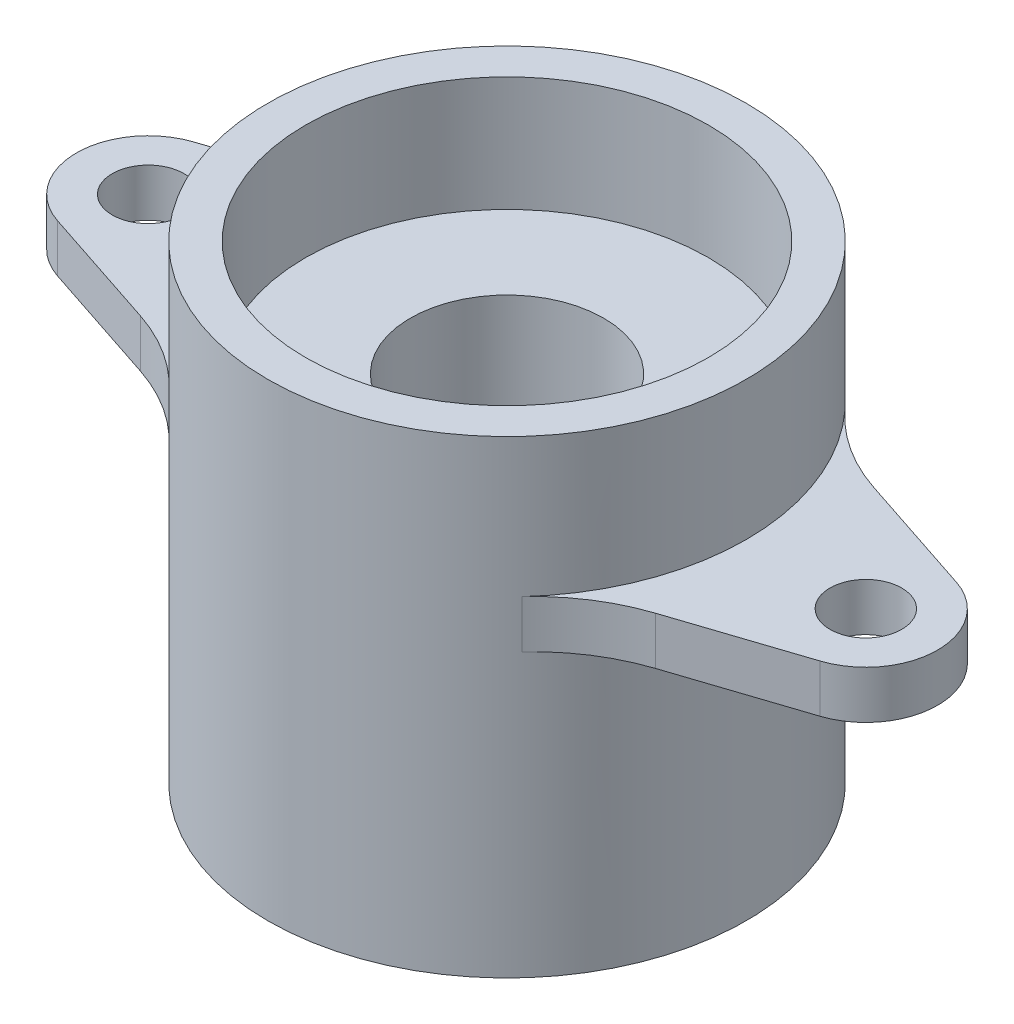
ISO-10303-21;
HEADER;
FILE_DESCRIPTION(('STEP AP214'),'2;1');
FILE_NAME('part.step','',(''),(''),'','','');
FILE_SCHEMA(('AUTOMOTIVE_DESIGN { 1 0 10303 214 1 1 1 1 }'));
ENDSEC;
DATA;
#1=APPLICATION_CONTEXT('core data for automotive mechanical design processes');
#2=APPLICATION_PROTOCOL_DEFINITION('international standard','automotive_design',2000,#1);
#3=PRODUCT_CONTEXT('',#1,'mechanical');
#4=PRODUCT('Part','Part','',(#3));
#5=PRODUCT_RELATED_PRODUCT_CATEGORY('part','',(#4));
#6=PRODUCT_DEFINITION_FORMATION('','',#4);
#7=PRODUCT_DEFINITION_CONTEXT('part definition',#1,'design');
#8=PRODUCT_DEFINITION('design','',#6,#7);
#9=PRODUCT_DEFINITION_SHAPE('','',#8);
#10=(LENGTH_UNIT() NAMED_UNIT(*) SI_UNIT(.MILLI.,.METRE.));
#11=(NAMED_UNIT(*) PLANE_ANGLE_UNIT() SI_UNIT($,.RADIAN.));
#12=(NAMED_UNIT(*) SI_UNIT($,.STERADIAN.) SOLID_ANGLE_UNIT());
#13=UNCERTAINTY_MEASURE_WITH_UNIT(LENGTH_MEASURE(1.E-05),#10,'distance_accuracy_value','');
#14=(GEOMETRIC_REPRESENTATION_CONTEXT(3) GLOBAL_UNCERTAINTY_ASSIGNED_CONTEXT((#13)) GLOBAL_UNIT_ASSIGNED_CONTEXT((#10,
#11,#12)) REPRESENTATION_CONTEXT('',''));
#15=CARTESIAN_POINT('',(0.,0.,0.));
#16=DIRECTION('',(0.,0.,1.));
#17=DIRECTION('',(1.,0.,0.));
#18=AXIS2_PLACEMENT_3D('',#15,#16,#17);
#19=CARTESIAN_POINT('',(0.,0.,0.));
#20=DIRECTION('',(0.,-1.,0.));
#21=DIRECTION('',(0.,0.,-1.));
#22=AXIS2_PLACEMENT_3D('',#19,#20,#21);
#23=CYLINDRICAL_SURFACE('',#22,25.);
#24=CARTESIAN_POINT('',(0.,24.5,0.));
#25=DIRECTION('',(0.,-1.,0.));
#26=DIRECTION('',(0.,0.,-1.));
#27=AXIS2_PLACEMENT_3D('',#24,#25,#26);
#28=CIRCLE('',#27,25.);
#29=CARTESIAN_POINT('',(0.,24.5,-25.));
#30=VERTEX_POINT('',#29);
#31=EDGE_CURVE('E280',#30,#30,#28,.T.);
#32=ORIENTED_EDGE('',*,*,#31,.T.);
#33=EDGE_LOOP('',(#32));
#34=FACE_BOUND('',#33,.T.);
#35=CARTESIAN_POINT('',(0.,-24.5,0.));
#36=DIRECTION('',(0.,-1.,0.));
#37=DIRECTION('',(0.,0.,-1.));
#38=AXIS2_PLACEMENT_3D('',#35,#36,#37);
#39=CIRCLE('',#38,25.);
#40=CARTESIAN_POINT('',(0.,-24.5,-25.));
#41=VERTEX_POINT('',#40);
#42=EDGE_CURVE('E276',#41,#41,#39,.T.);
#43=ORIENTED_EDGE('',*,*,#42,.F.);
#44=EDGE_LOOP('',(#43));
#45=FACE_BOUND('',#44,.T.);
#46=CARTESIAN_POINT('',(0.,10.,0.));
#47=DIRECTION('',(0.,1.,0.));
#48=DIRECTION('',(0.,0.,1.));
#49=AXIS2_PLACEMENT_3D('',#46,#47,#48);
#50=CIRCLE('',#49,25.);
#51=CARTESIAN_POINT('',(-18.4382654759895,10.,16.8828423624973));
#52=VERTEX_POINT('',#51);
#53=CARTESIAN_POINT('',(-18.4382654759895,10.,-16.8828423624973));
#54=VERTEX_POINT('',#53);
#55=EDGE_CURVE('E291',#52,#54,#50,.F.);
#56=ORIENTED_EDGE('',*,*,#55,.F.);
#57=DIRECTION('',(0.,-1.,0.));
#58=VECTOR('',#57,1.);
#59=CARTESIAN_POINT('',(-18.4382654759895,10.,16.8828423624973));
#60=LINE('',#59,#58);
#61=CARTESIAN_POINT('',(-18.4382654759895,5.,16.8828423624973));
#62=VERTEX_POINT('',#61);
#63=EDGE_CURVE('E245',#52,#62,#60,.T.);
#64=ORIENTED_EDGE('',*,*,#63,.T.);
#65=CARTESIAN_POINT('',(0.,5.,0.));
#66=DIRECTION('',(0.,1.,0.));
#67=DIRECTION('',(0.,0.,1.));
#68=AXIS2_PLACEMENT_3D('',#65,#66,#67);
#69=CIRCLE('',#68,25.);
#70=CARTESIAN_POINT('',(-18.4382654759895,5.,-16.8828423624973));
#71=VERTEX_POINT('',#70);
#72=EDGE_CURVE('E288',#62,#71,#69,.F.);
#73=ORIENTED_EDGE('',*,*,#72,.T.);
#74=DIRECTION('',(0.,-1.,0.));
#75=VECTOR('',#74,1.);
#76=CARTESIAN_POINT('',(-18.4382654759895,10.,-16.8828423624973));
#77=LINE('',#76,#75);
#78=EDGE_CURVE('E241',#54,#71,#77,.T.);
#79=ORIENTED_EDGE('',*,*,#78,.F.);
#80=EDGE_LOOP('',(#56,#64,#73,#79));
#81=FACE_BOUND('',#80,.T.);
#82=CARTESIAN_POINT('',(0.,10.,0.));
#83=DIRECTION('',(0.,-1.,0.));
#84=DIRECTION('',(0.,0.,-1.));
#85=AXIS2_PLACEMENT_3D('',#82,#83,#84);
#86=CIRCLE('',#85,25.);
#87=CARTESIAN_POINT('',(18.4382654759895,10.,16.8828423624973));
#88=VERTEX_POINT('',#87);
#89=CARTESIAN_POINT('',(18.4382654759895,10.,-16.8828423624973));
#90=VERTEX_POINT('',#89);
#91=EDGE_CURVE('E11',#88,#90,#86,.F.);
#92=ORIENTED_EDGE('',*,*,#91,.T.);
#93=DIRECTION('',(0.,-1.,0.));
#94=VECTOR('',#93,1.);
#95=CARTESIAN_POINT('',(18.4382654759895,10.,-16.8828423624973));
#96=LINE('',#95,#94);
#97=CARTESIAN_POINT('',(18.4382654759895,5.,-16.8828423624973));
#98=VERTEX_POINT('',#97);
#99=EDGE_CURVE('E58',#90,#98,#96,.T.);
#100=ORIENTED_EDGE('',*,*,#99,.T.);
#101=CARTESIAN_POINT('',(0.,5.,0.));
#102=DIRECTION('',(0.,-1.,0.));
#103=DIRECTION('',(0.,0.,-1.));
#104=AXIS2_PLACEMENT_3D('',#101,#102,#103);
#105=CIRCLE('',#104,25.);
#106=CARTESIAN_POINT('',(18.4382654759895,5.,16.8828423624973));
#107=VERTEX_POINT('',#106);
#108=EDGE_CURVE('E48',#107,#98,#105,.F.);
#109=ORIENTED_EDGE('',*,*,#108,.F.);
#110=DIRECTION('',(0.,-1.,0.));
#111=VECTOR('',#110,1.);
#112=CARTESIAN_POINT('',(18.4382654759895,10.,16.8828423624973));
#113=LINE('',#112,#111);
#114=EDGE_CURVE('E145',#88,#107,#113,.T.);
#115=ORIENTED_EDGE('',*,*,#114,.F.);
#116=EDGE_LOOP('',(#92,#100,#109,#115));
#117=FACE_BOUND('',#116,.T.);
#118=ADVANCED_FACE('F39',(#34,#45,#81,#117),#23,.T.);
#119=CARTESIAN_POINT('',(0.,0.,0.));
#120=DIRECTION('',(0.,-1.,0.));
#121=DIRECTION('',(0.,0.,-1.));
#122=AXIS2_PLACEMENT_3D('',#119,#120,#121);
#123=CYLINDRICAL_SURFACE('',#122,21.05);
#124=CARTESIAN_POINT('',(0.,12.5,0.));
#125=DIRECTION('',(0.,-1.,0.));
#126=DIRECTION('',(0.,0.,-1.));
#127=AXIS2_PLACEMENT_3D('',#124,#125,#126);
#128=CIRCLE('',#127,21.05);
#129=CARTESIAN_POINT('',(0.,12.5,-21.05));
#130=VERTEX_POINT('',#129);
#131=EDGE_CURVE('E256',#130,#130,#128,.T.);
#132=ORIENTED_EDGE('',*,*,#131,.T.);
#133=EDGE_LOOP('',(#132));
#134=FACE_BOUND('',#133,.T.);
#135=CARTESIAN_POINT('',(0.,24.5,0.));
#136=DIRECTION('',(0.,-1.,0.));
#137=DIRECTION('',(0.,0.,-1.));
#138=AXIS2_PLACEMENT_3D('',#135,#136,#137);
#139=CIRCLE('',#138,21.05);
#140=CARTESIAN_POINT('',(0.,24.5,-21.05));
#141=VERTEX_POINT('',#140);
#142=EDGE_CURVE('E284',#141,#141,#139,.T.);
#143=ORIENTED_EDGE('',*,*,#142,.F.);
#144=EDGE_LOOP('',(#143));
#145=FACE_BOUND('',#144,.T.);
#146=ADVANCED_FACE('F41',(#134,#145),#123,.F.);
#147=CARTESIAN_POINT('',(21.05,24.5,0.));
#148=DIRECTION('',(0.,1.,0.));
#149=DIRECTION('',(0.,0.,1.));
#150=AXIS2_PLACEMENT_3D('',#147,#148,#149);
#151=PLANE('',#150);
#152=ORIENTED_EDGE('',*,*,#142,.T.);
#153=EDGE_LOOP('',(#152));
#154=FACE_BOUND('',#153,.T.);
#155=ORIENTED_EDGE('',*,*,#31,.F.);
#156=EDGE_LOOP('',(#155));
#157=FACE_BOUND('',#156,.T.);
#158=ADVANCED_FACE('F341',(#154,#157),#151,.T.);
#159=CARTESIAN_POINT('',(25.,-24.5,0.));
#160=DIRECTION('',(0.,-1.,0.));
#161=DIRECTION('',(0.,0.,-1.));
#162=AXIS2_PLACEMENT_3D('',#159,#160,#161);
#163=PLANE('',#162);
#164=ORIENTED_EDGE('',*,*,#42,.T.);
#165=EDGE_LOOP('',(#164));
#166=FACE_BOUND('',#165,.T.);
#167=CARTESIAN_POINT('',(0.,-24.5,0.));
#168=DIRECTION('',(0.,-1.,0.));
#169=DIRECTION('',(0.,0.,-1.));
#170=AXIS2_PLACEMENT_3D('',#167,#168,#169);
#171=CIRCLE('',#170,21.05);
#172=CARTESIAN_POINT('',(0.,-24.5,-21.05));
#173=VERTEX_POINT('',#172);
#174=EDGE_CURVE('E272',#173,#173,#171,.T.);
#175=ORIENTED_EDGE('',*,*,#174,.F.);
#176=EDGE_LOOP('',(#175));
#177=FACE_BOUND('',#176,.T.);
#178=ADVANCED_FACE('F345',(#166,#177),#163,.T.);
#179=CARTESIAN_POINT('',(0.,0.,0.));
#180=DIRECTION('',(0.,-1.,0.));
#181=DIRECTION('',(0.,0.,-1.));
#182=AXIS2_PLACEMENT_3D('',#179,#180,#181);
#183=CYLINDRICAL_SURFACE('',#182,21.05);
#184=ORIENTED_EDGE('',*,*,#174,.T.);
#185=EDGE_LOOP('',(#184));
#186=FACE_BOUND('',#185,.T.);
#187=CARTESIAN_POINT('',(0.,-12.5,0.));
#188=DIRECTION('',(0.,-1.,0.));
#189=DIRECTION('',(0.,0.,-1.));
#190=AXIS2_PLACEMENT_3D('',#187,#188,#189);
#191=CIRCLE('',#190,21.05);
#192=CARTESIAN_POINT('',(0.,-12.5,-21.05));
#193=VERTEX_POINT('',#192);
#194=EDGE_CURVE('E268',#193,#193,#191,.T.);
#195=ORIENTED_EDGE('',*,*,#194,.F.);
#196=EDGE_LOOP('',(#195));
#197=FACE_BOUND('',#196,.T.);
#198=ADVANCED_FACE('F352',(#186,#197),#183,.F.);
#199=CARTESIAN_POINT('',(21.05,-12.5,0.));
#200=DIRECTION('',(0.,-1.,0.));
#201=DIRECTION('',(0.,0.,-1.));
#202=AXIS2_PLACEMENT_3D('',#199,#200,#201);
#203=PLANE('',#202);
#204=ORIENTED_EDGE('',*,*,#194,.T.);
#205=EDGE_LOOP('',(#204));
#206=FACE_BOUND('',#205,.T.);
#207=CARTESIAN_POINT('',(0.,-12.5,0.));
#208=DIRECTION('',(0.,-1.,0.));
#209=DIRECTION('',(0.,0.,-1.));
#210=AXIS2_PLACEMENT_3D('',#207,#208,#209);
#211=CIRCLE('',#210,10.1);
#212=CARTESIAN_POINT('',(0.,-12.5,-10.1));
#213=VERTEX_POINT('',#212);
#214=EDGE_CURVE('E264',#213,#213,#211,.T.);
#215=ORIENTED_EDGE('',*,*,#214,.F.);
#216=EDGE_LOOP('',(#215));
#217=FACE_BOUND('',#216,.T.);
#218=ADVANCED_FACE('F361',(#206,#217),#203,.T.);
#219=CARTESIAN_POINT('',(0.,0.,0.));
#220=DIRECTION('',(0.,-1.,0.));
#221=DIRECTION('',(0.,0.,-1.));
#222=AXIS2_PLACEMENT_3D('',#219,#220,#221);
#223=CYLINDRICAL_SURFACE('',#222,10.1);
#224=ORIENTED_EDGE('',*,*,#214,.T.);
#225=EDGE_LOOP('',(#224));
#226=FACE_BOUND('',#225,.T.);
#227=CARTESIAN_POINT('',(0.,12.5,0.));
#228=DIRECTION('',(0.,-1.,0.));
#229=DIRECTION('',(0.,0.,-1.));
#230=AXIS2_PLACEMENT_3D('',#227,#228,#229);
#231=CIRCLE('',#230,10.1);
#232=CARTESIAN_POINT('',(0.,12.5,-10.1));
#233=VERTEX_POINT('',#232);
#234=EDGE_CURVE('E260',#233,#233,#231,.T.);
#235=ORIENTED_EDGE('',*,*,#234,.F.);
#236=EDGE_LOOP('',(#235));
#237=FACE_BOUND('',#236,.T.);
#238=ADVANCED_FACE('F371',(#226,#237),#223,.F.);
#239=CARTESIAN_POINT('',(21.05,12.5,0.));
#240=DIRECTION('',(0.,1.,0.));
#241=DIRECTION('',(0.,0.,1.));
#242=AXIS2_PLACEMENT_3D('',#239,#240,#241);
#243=PLANE('',#242);
#244=ORIENTED_EDGE('',*,*,#234,.T.);
#245=EDGE_LOOP('',(#244));
#246=FACE_BOUND('',#245,.T.);
#247=ORIENTED_EDGE('',*,*,#131,.F.);
#248=EDGE_LOOP('',(#247));
#249=FACE_BOUND('',#248,.T.);
#250=ADVANCED_FACE('F377',(#246,#249),#243,.T.);
#251=CARTESIAN_POINT('',(-37.5,10.,0.));
#252=DIRECTION('',(0.,1.,0.));
#253=DIRECTION('',(0.,0.,1.));
#254=AXIS2_PLACEMENT_3D('',#251,#252,#253);
#255=PLANE('',#254);
#256=CARTESIAN_POINT('',(-33.1888778567811,10.,30.3891162524951));
#257=DIRECTION('',(0.,-1.,0.));
#258=DIRECTION('',(0.,0.,-1.));
#259=AXIS2_PLACEMENT_3D('',#256,#257,#258);
#260=CIRCLE('',#259,20.);
#261=CARTESIAN_POINT('',(-26.9110602993782,10.,11.3999349453412));
#262=VERTEX_POINT('',#261);
#263=EDGE_CURVE('E208',#262,#52,#260,.T.);
#264=ORIENTED_EDGE('',*,*,#263,.T.);
#265=ORIENTED_EDGE('',*,*,#55,.T.);
#266=CARTESIAN_POINT('',(-33.1888778567811,10.,-30.3891162524951));
#267=DIRECTION('',(0.,-1.,0.));
#268=DIRECTION('',(0.,0.,1.));
#269=AXIS2_PLACEMENT_3D('',#266,#267,#268);
#270=CIRCLE('',#269,20.);
#271=CARTESIAN_POINT('',(-26.9110602993782,10.,-11.3999349453412));
#272=VERTEX_POINT('',#271);
#273=EDGE_CURVE('E212',#54,#272,#270,.T.);
#274=ORIENTED_EDGE('',*,*,#273,.T.);
#275=DIRECTION('',(-0.949459065357696,0.,0.313890877870145));
#276=VECTOR('',#275,1.);
#277=CARTESIAN_POINT('',(-39.8541815840261,10.,-7.12094299018272));
#278=LINE('',#277,#276);
#279=CARTESIAN_POINT('',(-39.8541815840261,10.,-7.12094299018272));
#280=VERTEX_POINT('',#279);
#281=EDGE_CURVE('E215',#272,#280,#278,.T.);
#282=ORIENTED_EDGE('',*,*,#281,.T.);
#283=CARTESIAN_POINT('',(-37.5,10.,0.));
#284=DIRECTION('',(0.,1.,0.));
#285=DIRECTION('',(0.,0.,1.));
#286=AXIS2_PLACEMENT_3D('',#283,#284,#285);
#287=CIRCLE('',#286,7.5);
#288=CARTESIAN_POINT('',(-39.8541815840261,10.,7.12094299018272));
#289=VERTEX_POINT('',#288);
#290=EDGE_CURVE('E200',#280,#289,#287,.T.);
#291=ORIENTED_EDGE('',*,*,#290,.T.);
#292=DIRECTION('',(0.949459065357696,0.,0.313890877870145));
#293=VECTOR('',#292,1.);
#294=CARTESIAN_POINT('',(-39.8541815840261,10.,7.12094299018272));
#295=LINE('',#294,#293);
#296=EDGE_CURVE('E204',#289,#262,#295,.T.);
#297=ORIENTED_EDGE('',*,*,#296,.T.);
#298=EDGE_LOOP('',(#264,#265,#274,#282,#291,#297));
#299=FACE_BOUND('',#298,.T.);
#300=CARTESIAN_POINT('',(-37.5,10.,0.));
#301=DIRECTION('',(0.,1.,0.));
#302=DIRECTION('',(0.,0.,1.));
#303=AXIS2_PLACEMENT_3D('',#300,#301,#302);
#304=CIRCLE('',#303,3.75000000000001);
#305=CARTESIAN_POINT('',(-37.5,10.,3.75000000000001));
#306=VERTEX_POINT('',#305);
#307=EDGE_CURVE('E192',#306,#306,#304,.T.);
#308=ORIENTED_EDGE('',*,*,#307,.F.);
#309=EDGE_LOOP('',(#308));
#310=FACE_BOUND('',#309,.T.);
#311=ADVANCED_FACE('F383',(#299,#310),#255,.T.);
#312=CARTESIAN_POINT('',(-37.5,5.,0.));
#313=DIRECTION('',(0.,1.,0.));
#314=DIRECTION('',(0.,0.,1.));
#315=AXIS2_PLACEMENT_3D('',#312,#313,#314);
#316=PLANE('',#315);
#317=ORIENTED_EDGE('',*,*,#72,.F.);
#318=CARTESIAN_POINT('',(-33.1888778567811,5.,30.3891162524951));
#319=DIRECTION('',(0.,-1.,0.));
#320=DIRECTION('',(0.,0.,-1.));
#321=AXIS2_PLACEMENT_3D('',#318,#319,#320);
#322=CIRCLE('',#321,20.);
#323=CARTESIAN_POINT('',(-26.9110602993782,5.,11.3999349453412));
#324=VERTEX_POINT('',#323);
#325=EDGE_CURVE('E225',#324,#62,#322,.T.);
#326=ORIENTED_EDGE('',*,*,#325,.F.);
#327=DIRECTION('',(0.949459065357696,0.,0.313890877870145));
#328=VECTOR('',#327,1.);
#329=CARTESIAN_POINT('',(-39.8541815840261,5.,7.12094299018272));
#330=LINE('',#329,#328);
#331=CARTESIAN_POINT('',(-39.8541815840261,5.,7.12094299018272));
#332=VERTEX_POINT('',#331);
#333=EDGE_CURVE('E222',#332,#324,#330,.T.);
#334=ORIENTED_EDGE('',*,*,#333,.F.);
#335=CARTESIAN_POINT('',(-37.5,5.,0.));
#336=DIRECTION('',(0.,1.,0.));
#337=DIRECTION('',(0.,0.,1.));
#338=AXIS2_PLACEMENT_3D('',#335,#336,#337);
#339=CIRCLE('',#338,7.5);
#340=CARTESIAN_POINT('',(-39.8541815840261,5.,-7.12094299018272));
#341=VERTEX_POINT('',#340);
#342=EDGE_CURVE('E196',#341,#332,#339,.T.);
#343=ORIENTED_EDGE('',*,*,#342,.F.);
#344=DIRECTION('',(-0.949459065357696,0.,0.313890877870145));
#345=VECTOR('',#344,1.);
#346=CARTESIAN_POINT('',(-39.8541815840261,5.,-7.12094299018272));
#347=LINE('',#346,#345);
#348=CARTESIAN_POINT('',(-26.9110602993782,5.,-11.3999349453412));
#349=VERTEX_POINT('',#348);
#350=EDGE_CURVE('E205',#349,#341,#347,.T.);
#351=ORIENTED_EDGE('',*,*,#350,.F.);
#352=CARTESIAN_POINT('',(-33.1888778567811,5.,-30.3891162524951));
#353=DIRECTION('',(0.,-1.,0.));
#354=DIRECTION('',(0.,0.,1.));
#355=AXIS2_PLACEMENT_3D('',#352,#353,#354);
#356=CIRCLE('',#355,20.);
#357=EDGE_CURVE('E229',#71,#349,#356,.T.);
#358=ORIENTED_EDGE('',*,*,#357,.F.);
#359=EDGE_LOOP('',(#317,#326,#334,#343,#351,#358));
#360=FACE_BOUND('',#359,.T.);
#361=CARTESIAN_POINT('',(-37.5,5.,0.));
#362=DIRECTION('',(0.,1.,0.));
#363=DIRECTION('',(0.,0.,1.));
#364=AXIS2_PLACEMENT_3D('',#361,#362,#363);
#365=CIRCLE('',#364,3.75000000000001);
#366=CARTESIAN_POINT('',(-37.5,5.,3.75000000000001));
#367=VERTEX_POINT('',#366);
#368=EDGE_CURVE('E191',#367,#367,#365,.T.);
#369=ORIENTED_EDGE('',*,*,#368,.T.);
#370=EDGE_LOOP('',(#369));
#371=FACE_BOUND('',#370,.T.);
#372=ADVANCED_FACE('F389',(#360,#371),#316,.F.);
#373=CARTESIAN_POINT('',(-37.5,10.,0.));
#374=DIRECTION('',(0.,-1.,0.));
#375=DIRECTION('',(0.,0.,-1.));
#376=AXIS2_PLACEMENT_3D('',#373,#374,#375);
#377=CYLINDRICAL_SURFACE('',#376,7.5);
#378=ORIENTED_EDGE('',*,*,#342,.T.);
#379=DIRECTION('',(0.,-1.,0.));
#380=VECTOR('',#379,1.);
#381=CARTESIAN_POINT('',(-39.8541815840261,10.,7.12094299018272));
#382=LINE('',#381,#380);
#383=EDGE_CURVE('E252',#289,#332,#382,.T.);
#384=ORIENTED_EDGE('',*,*,#383,.F.);
#385=ORIENTED_EDGE('',*,*,#290,.F.);
#386=DIRECTION('',(0.,-1.,0.));
#387=VECTOR('',#386,1.);
#388=CARTESIAN_POINT('',(-39.8541815840261,10.,-7.12094299018272));
#389=LINE('',#388,#387);
#390=EDGE_CURVE('E218',#280,#341,#389,.T.);
#391=ORIENTED_EDGE('',*,*,#390,.T.);
#392=EDGE_LOOP('',(#378,#384,#385,#391));
#393=FACE_BOUND('',#392,.T.);
#394=ADVANCED_FACE('F393',(#393),#377,.T.);
#395=CARTESIAN_POINT('',(-39.8541815840261,10.,7.12094299018272));
#396=DIRECTION('',(0.313890877870145,0.,-0.949459065357696));
#397=DIRECTION('',(-0.949459065357696,0.,-0.313890877870145));
#398=AXIS2_PLACEMENT_3D('',#395,#396,#397);
#399=PLANE('',#398);
#400=ORIENTED_EDGE('',*,*,#333,.T.);
#401=DIRECTION('',(0.,-1.,0.));
#402=VECTOR('',#401,1.);
#403=CARTESIAN_POINT('',(-26.9110602993782,10.,11.3999349453412));
#404=LINE('',#403,#402);
#405=EDGE_CURVE('E248',#262,#324,#404,.T.);
#406=ORIENTED_EDGE('',*,*,#405,.F.);
#407=ORIENTED_EDGE('',*,*,#296,.F.);
#408=ORIENTED_EDGE('',*,*,#383,.T.);
#409=EDGE_LOOP('',(#400,#406,#407,#408));
#410=FACE_BOUND('',#409,.T.);
#411=ADVANCED_FACE('F396',(#410),#399,.F.);
#412=CARTESIAN_POINT('',(-33.1888778567811,10.,30.3891162524951));
#413=DIRECTION('',(0.,-1.,0.));
#414=DIRECTION('',(0.,0.,-1.));
#415=AXIS2_PLACEMENT_3D('',#412,#413,#414);
#416=CYLINDRICAL_SURFACE('',#415,20.);
#417=ORIENTED_EDGE('',*,*,#325,.T.);
#418=ORIENTED_EDGE('',*,*,#63,.F.);
#419=ORIENTED_EDGE('',*,*,#263,.F.);
#420=ORIENTED_EDGE('',*,*,#405,.T.);
#421=EDGE_LOOP('',(#417,#418,#419,#420));
#422=FACE_BOUND('',#421,.T.);
#423=ADVANCED_FACE('F400',(#422),#416,.F.);
#424=CARTESIAN_POINT('',(-33.1888778567811,10.,-30.3891162524951));
#425=DIRECTION('',(0.,-1.,0.));
#426=DIRECTION('',(0.,0.,-1.));
#427=AXIS2_PLACEMENT_3D('',#424,#425,#426);
#428=CYLINDRICAL_SURFACE('',#427,20.);
#429=ORIENTED_EDGE('',*,*,#357,.T.);
#430=DIRECTION('',(0.,-1.,0.));
#431=VECTOR('',#430,1.);
#432=CARTESIAN_POINT('',(-26.9110602993782,10.,-11.3999349453412));
#433=LINE('',#432,#431);
#434=EDGE_CURVE('E237',#272,#349,#433,.T.);
#435=ORIENTED_EDGE('',*,*,#434,.F.);
#436=ORIENTED_EDGE('',*,*,#273,.F.);
#437=ORIENTED_EDGE('',*,*,#78,.T.);
#438=EDGE_LOOP('',(#429,#435,#436,#437));
#439=FACE_BOUND('',#438,.T.);
#440=ADVANCED_FACE('F404',(#439),#428,.F.);
#441=CARTESIAN_POINT('',(-39.8541815840261,10.,-7.12094299018272));
#442=DIRECTION('',(0.313890877870145,0.,0.949459065357696));
#443=DIRECTION('',(0.949459065357696,0.,-0.313890877870145));
#444=AXIS2_PLACEMENT_3D('',#441,#442,#443);
#445=PLANE('',#444);
#446=ORIENTED_EDGE('',*,*,#350,.T.);
#447=ORIENTED_EDGE('',*,*,#390,.F.);
#448=ORIENTED_EDGE('',*,*,#281,.F.);
#449=ORIENTED_EDGE('',*,*,#434,.T.);
#450=EDGE_LOOP('',(#446,#447,#448,#449));
#451=FACE_BOUND('',#450,.T.);
#452=ADVANCED_FACE('F331',(#451),#445,.F.);
#453=CARTESIAN_POINT('',(-37.5,10.,0.));
#454=DIRECTION('',(0.,-1.,0.));
#455=DIRECTION('',(0.,0.,-1.));
#456=AXIS2_PLACEMENT_3D('',#453,#454,#455);
#457=CYLINDRICAL_SURFACE('',#456,3.75000000000001);
#458=ORIENTED_EDGE('',*,*,#307,.T.);
#459=EDGE_LOOP('',(#458));
#460=FACE_BOUND('',#459,.T.);
#461=ORIENTED_EDGE('',*,*,#368,.F.);
#462=EDGE_LOOP('',(#461));
#463=FACE_BOUND('',#462,.T.);
#464=ADVANCED_FACE('F324',(#460,#463),#457,.F.);
#465=CARTESIAN_POINT('',(33.1888778567811,10.,-30.3891162524951));
#466=DIRECTION('',(0.,-1.,0.));
#467=DIRECTION('',(0.,0.,-1.));
#468=AXIS2_PLACEMENT_3D('',#465,#466,#467);
#469=PLANE('',#468);
#470=ORIENTED_EDGE('',*,*,#91,.F.);
#471=CARTESIAN_POINT('',(33.1888778567811,10.,30.3891162524951));
#472=DIRECTION('',(0.,-1.,0.));
#473=DIRECTION('',(0.,0.,1.));
#474=AXIS2_PLACEMENT_3D('',#471,#472,#473);
#475=CIRCLE('',#474,20.);
#476=CARTESIAN_POINT('',(26.9110602993782,10.,11.3999349453412));
#477=VERTEX_POINT('',#476);
#478=EDGE_CURVE('E125',#88,#477,#475,.T.);
#479=ORIENTED_EDGE('',*,*,#478,.T.);
#480=DIRECTION('',(0.949459065357696,0.,-0.313890877870145));
#481=VECTOR('',#480,1.);
#482=CARTESIAN_POINT('',(39.8541815840261,10.,7.12094299018272));
#483=LINE('',#482,#481);
#484=CARTESIAN_POINT('',(39.8541815840261,10.,7.12094299018272));
#485=VERTEX_POINT('',#484);
#486=EDGE_CURVE('E130',#477,#485,#483,.T.);
#487=ORIENTED_EDGE('',*,*,#486,.T.);
#488=CARTESIAN_POINT('',(37.5,10.,0.));
#489=DIRECTION('',(0.,1.,0.));
#490=DIRECTION('',(0.,0.,-1.));
#491=AXIS2_PLACEMENT_3D('',#488,#489,#490);
#492=CIRCLE('',#491,7.5);
#493=CARTESIAN_POINT('',(39.8541815840261,10.,-7.12094299018272));
#494=VERTEX_POINT('',#493);
#495=EDGE_CURVE('E152',#485,#494,#492,.T.);
#496=ORIENTED_EDGE('',*,*,#495,.T.);
#497=DIRECTION('',(-0.949459065357696,0.,-0.313890877870145));
#498=VECTOR('',#497,1.);
#499=CARTESIAN_POINT('',(39.8541815840261,10.,-7.12094299018272));
#500=LINE('',#499,#498);
#501=CARTESIAN_POINT('',(26.9110602993782,10.,-11.3999349453412));
#502=VERTEX_POINT('',#501);
#503=EDGE_CURVE('E155',#494,#502,#500,.T.);
#504=ORIENTED_EDGE('',*,*,#503,.T.);
#505=CARTESIAN_POINT('',(33.1888778567811,10.,-30.3891162524951));
#506=DIRECTION('',(0.,-1.,0.));
#507=DIRECTION('',(0.,0.,-1.));
#508=AXIS2_PLACEMENT_3D('',#505,#506,#507);
#509=CIRCLE('',#508,20.);
#510=EDGE_CURVE('E135',#502,#90,#509,.T.);
#511=ORIENTED_EDGE('',*,*,#510,.T.);
#512=EDGE_LOOP('',(#470,#479,#487,#496,#504,#511));
#513=FACE_BOUND('',#512,.T.);
#514=CARTESIAN_POINT('',(37.5,10.,0.));
#515=DIRECTION('',(0.,1.,0.));
#516=DIRECTION('',(0.,0.,-1.));
#517=AXIS2_PLACEMENT_3D('',#514,#515,#516);
#518=CIRCLE('',#517,3.75000000000012);
#519=CARTESIAN_POINT('',(37.5,10.,-3.75000000000012));
#520=VERTEX_POINT('',#519);
#521=EDGE_CURVE('E166',#520,#520,#518,.T.);
#522=ORIENTED_EDGE('',*,*,#521,.F.);
#523=EDGE_LOOP('',(#522));
#524=FACE_BOUND('',#523,.T.);
#525=ADVANCED_FACE('F127',(#513,#524),#469,.F.);
#526=CARTESIAN_POINT('',(33.1888778567811,5.,-30.3891162524951));
#527=DIRECTION('',(0.,-1.,0.));
#528=DIRECTION('',(0.,0.,-1.));
#529=AXIS2_PLACEMENT_3D('',#526,#527,#528);
#530=PLANE('',#529);
#531=CARTESIAN_POINT('',(33.1888778567811,5.,30.3891162524951));
#532=DIRECTION('',(0.,-1.,0.));
#533=DIRECTION('',(0.,0.,1.));
#534=AXIS2_PLACEMENT_3D('',#531,#532,#533);
#535=CIRCLE('',#534,20.);
#536=CARTESIAN_POINT('',(26.9110602993782,5.,11.3999349453412));
#537=VERTEX_POINT('',#536);
#538=EDGE_CURVE('E141',#107,#537,#535,.T.);
#539=ORIENTED_EDGE('',*,*,#538,.F.);
#540=ORIENTED_EDGE('',*,*,#108,.T.);
#541=CARTESIAN_POINT('',(33.1888778567811,5.,-30.3891162524951));
#542=DIRECTION('',(0.,-1.,0.));
#543=DIRECTION('',(0.,0.,-1.));
#544=AXIS2_PLACEMENT_3D('',#541,#542,#543);
#545=CIRCLE('',#544,20.);
#546=CARTESIAN_POINT('',(26.9110602993782,5.,-11.3999349453412));
#547=VERTEX_POINT('',#546);
#548=EDGE_CURVE('E162',#547,#98,#545,.T.);
#549=ORIENTED_EDGE('',*,*,#548,.F.);
#550=DIRECTION('',(-0.949459065357696,0.,-0.313890877870145));
#551=VECTOR('',#550,1.);
#552=CARTESIAN_POINT('',(39.8541815840261,5.,-7.12094299018272));
#553=LINE('',#552,#551);
#554=CARTESIAN_POINT('',(39.8541815840261,5.,-7.12094299018272));
#555=VERTEX_POINT('',#554);
#556=EDGE_CURVE('E175',#555,#547,#553,.T.);
#557=ORIENTED_EDGE('',*,*,#556,.F.);
#558=CARTESIAN_POINT('',(37.5,5.,0.));
#559=DIRECTION('',(0.,1.,0.));
#560=DIRECTION('',(0.,0.,-1.));
#561=AXIS2_PLACEMENT_3D('',#558,#559,#560);
#562=CIRCLE('',#561,7.5);
#563=CARTESIAN_POINT('',(39.8541815840261,5.,7.12094299018272));
#564=VERTEX_POINT('',#563);
#565=EDGE_CURVE('E172',#564,#555,#562,.T.);
#566=ORIENTED_EDGE('',*,*,#565,.F.);
#567=DIRECTION('',(0.949459065357696,0.,-0.313890877870145));
#568=VECTOR('',#567,1.);
#569=CARTESIAN_POINT('',(39.8541815840261,5.,7.12094299018272));
#570=LINE('',#569,#568);
#571=EDGE_CURVE('E169',#537,#564,#570,.T.);
#572=ORIENTED_EDGE('',*,*,#571,.F.);
#573=EDGE_LOOP('',(#539,#540,#549,#557,#566,#572));
#574=FACE_BOUND('',#573,.T.);
#575=CARTESIAN_POINT('',(37.5,5.,0.));
#576=DIRECTION('',(0.,1.,0.));
#577=DIRECTION('',(0.,0.,-1.));
#578=AXIS2_PLACEMENT_3D('',#575,#576,#577);
#579=CIRCLE('',#578,3.75000000000012);
#580=CARTESIAN_POINT('',(37.5,5.,-3.75000000000012));
#581=VERTEX_POINT('',#580);
#582=EDGE_CURVE('E313',#581,#581,#579,.T.);
#583=ORIENTED_EDGE('',*,*,#582,.T.);
#584=EDGE_LOOP('',(#583));
#585=FACE_BOUND('',#584,.T.);
#586=ADVANCED_FACE('F297',(#574,#585),#530,.T.);
#587=CARTESIAN_POINT('',(33.1888778567811,10.,-30.3891162524951));
#588=DIRECTION('',(0.,-1.,0.));
#589=DIRECTION('',(0.,0.,-1.));
#590=AXIS2_PLACEMENT_3D('',#587,#588,#589);
#591=CYLINDRICAL_SURFACE('',#590,20.);
#592=ORIENTED_EDGE('',*,*,#548,.T.);
#593=ORIENTED_EDGE('',*,*,#99,.F.);
#594=ORIENTED_EDGE('',*,*,#510,.F.);
#595=DIRECTION('',(0.,-1.,0.));
#596=VECTOR('',#595,1.);
#597=CARTESIAN_POINT('',(26.9110602993782,10.,-11.3999349453412));
#598=LINE('',#597,#596);
#599=EDGE_CURVE('E161',#502,#547,#598,.T.);
#600=ORIENTED_EDGE('',*,*,#599,.T.);
#601=EDGE_LOOP('',(#592,#593,#594,#600));
#602=FACE_BOUND('',#601,.T.);
#603=ADVANCED_FACE('F301',(#602),#591,.F.);
#604=CARTESIAN_POINT('',(33.1888778567811,10.,30.3891162524951));
#605=DIRECTION('',(0.,-1.,0.));
#606=DIRECTION('',(0.,0.,-1.));
#607=AXIS2_PLACEMENT_3D('',#604,#605,#606);
#608=CYLINDRICAL_SURFACE('',#607,20.);
#609=ORIENTED_EDGE('',*,*,#538,.T.);
#610=DIRECTION('',(0.,-1.,0.));
#611=VECTOR('',#610,1.);
#612=CARTESIAN_POINT('',(26.9110602993782,10.,11.3999349453412));
#613=LINE('',#612,#611);
#614=EDGE_CURVE('E138',#477,#537,#613,.T.);
#615=ORIENTED_EDGE('',*,*,#614,.F.);
#616=ORIENTED_EDGE('',*,*,#478,.F.);
#617=ORIENTED_EDGE('',*,*,#114,.T.);
#618=EDGE_LOOP('',(#609,#615,#616,#617));
#619=FACE_BOUND('',#618,.T.);
#620=ADVANCED_FACE('F139',(#619),#608,.F.);
#621=CARTESIAN_POINT('',(39.8541815840261,10.,7.12094299018272));
#622=DIRECTION('',(-0.313890877870145,0.,-0.949459065357696));
#623=DIRECTION('',(-0.949459065357696,0.,0.313890877870145));
#624=AXIS2_PLACEMENT_3D('',#621,#622,#623);
#625=PLANE('',#624);
#626=ORIENTED_EDGE('',*,*,#571,.T.);
#627=DIRECTION('',(0.,-1.,0.));
#628=VECTOR('',#627,1.);
#629=CARTESIAN_POINT('',(39.8541815840261,10.,7.12094299018272));
#630=LINE('',#629,#628);
#631=EDGE_CURVE('E146',#485,#564,#630,.T.);
#632=ORIENTED_EDGE('',*,*,#631,.F.);
#633=ORIENTED_EDGE('',*,*,#486,.F.);
#634=ORIENTED_EDGE('',*,*,#614,.T.);
#635=EDGE_LOOP('',(#626,#632,#633,#634));
#636=FACE_BOUND('',#635,.T.);
#637=ADVANCED_FACE('F148',(#636),#625,.F.);
#638=CARTESIAN_POINT('',(37.5,10.,0.));
#639=DIRECTION('',(0.,-1.,0.));
#640=DIRECTION('',(0.,0.,-1.));
#641=AXIS2_PLACEMENT_3D('',#638,#639,#640);
#642=CYLINDRICAL_SURFACE('',#641,7.5);
#643=ORIENTED_EDGE('',*,*,#565,.T.);
#644=DIRECTION('',(0.,-1.,0.));
#645=VECTOR('',#644,1.);
#646=CARTESIAN_POINT('',(39.8541815840261,10.,-7.12094299018272));
#647=LINE('',#646,#645);
#648=EDGE_CURVE('E181',#494,#555,#647,.T.);
#649=ORIENTED_EDGE('',*,*,#648,.F.);
#650=ORIENTED_EDGE('',*,*,#495,.F.);
#651=ORIENTED_EDGE('',*,*,#631,.T.);
#652=EDGE_LOOP('',(#643,#649,#650,#651));
#653=FACE_BOUND('',#652,.T.);
#654=ADVANCED_FACE('F310',(#653),#642,.T.);
#655=CARTESIAN_POINT('',(39.8541815840261,10.,-7.12094299018272));
#656=DIRECTION('',(-0.313890877870145,0.,0.949459065357696));
#657=DIRECTION('',(0.949459065357696,0.,0.313890877870145));
#658=AXIS2_PLACEMENT_3D('',#655,#656,#657);
#659=PLANE('',#658);
#660=ORIENTED_EDGE('',*,*,#556,.T.);
#661=ORIENTED_EDGE('',*,*,#599,.F.);
#662=ORIENTED_EDGE('',*,*,#503,.F.);
#663=ORIENTED_EDGE('',*,*,#648,.T.);
#664=EDGE_LOOP('',(#660,#661,#662,#663));
#665=FACE_BOUND('',#664,.T.);
#666=ADVANCED_FACE('F306',(#665),#659,.F.);
#667=CARTESIAN_POINT('',(37.5,10.,0.));
#668=DIRECTION('',(0.,-1.,0.));
#669=DIRECTION('',(0.,0.,-1.));
#670=AXIS2_PLACEMENT_3D('',#667,#668,#669);
#671=CYLINDRICAL_SURFACE('',#670,3.75000000000012);
#672=ORIENTED_EDGE('',*,*,#521,.T.);
#673=EDGE_LOOP('',(#672));
#674=FACE_BOUND('',#673,.T.);
#675=ORIENTED_EDGE('',*,*,#582,.F.);
#676=EDGE_LOOP('',(#675));
#677=FACE_BOUND('',#676,.T.);
#678=ADVANCED_FACE('F321',(#674,#677),#671,.F.);
#679=CLOSED_SHELL('',(#118,#146,#158,#178,#198,#218,#238,#250,#311,#372,#394,#411,#423,#440,
#452,#464,#525,#586,#603,#620,#637,#654,#666,#678));
#680=MANIFOLD_SOLID_BREP('B2',#679);
#681=ADVANCED_BREP_SHAPE_REPRESENTATION('',(#18,#680),#14);
#682=SHAPE_DEFINITION_REPRESENTATION(#9,#681);
ENDSEC;
END-ISO-10303-21;
